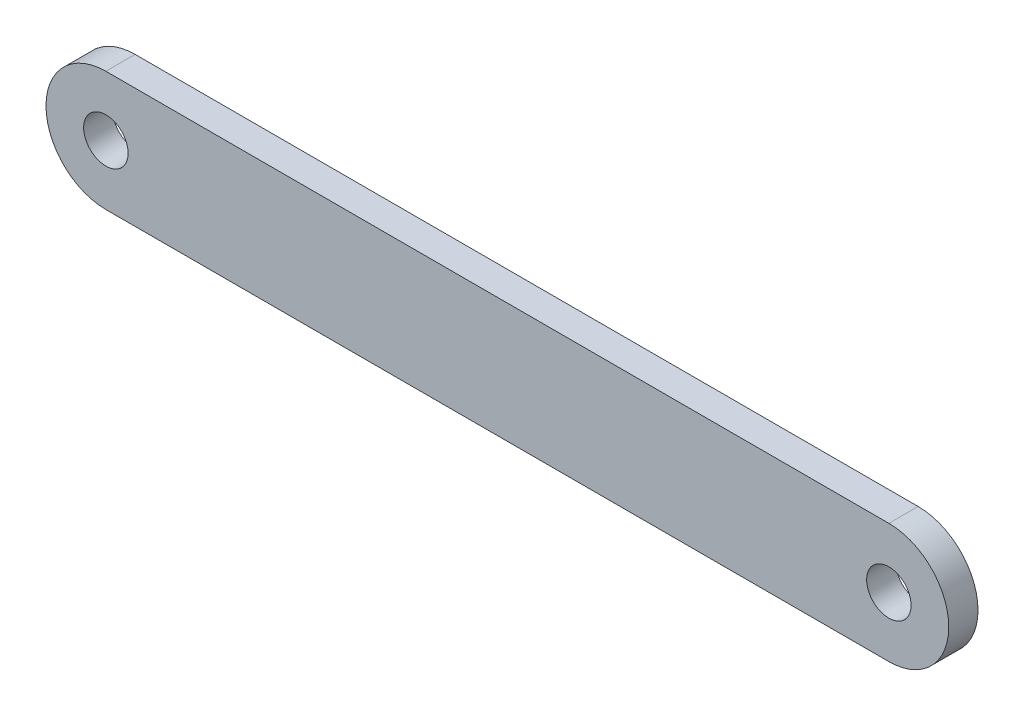
ISO-10303-21;
HEADER;
FILE_DESCRIPTION(('STEP AP214'),'2;1');
FILE_NAME('part.step','',(''),(''),'','','');
FILE_SCHEMA(('AUTOMOTIVE_DESIGN { 1 0 10303 214 1 1 1 1 }'));
ENDSEC;
DATA;
#1=APPLICATION_CONTEXT('core data for automotive mechanical design processes');
#2=APPLICATION_PROTOCOL_DEFINITION('international standard','automotive_design',2000,#1);
#3=PRODUCT_CONTEXT('',#1,'mechanical');
#4=PRODUCT('Part','Part','',(#3));
#5=PRODUCT_RELATED_PRODUCT_CATEGORY('part','',(#4));
#6=PRODUCT_DEFINITION_FORMATION('','',#4);
#7=PRODUCT_DEFINITION_CONTEXT('part definition',#1,'design');
#8=PRODUCT_DEFINITION('design','',#6,#7);
#9=PRODUCT_DEFINITION_SHAPE('','',#8);
#10=(LENGTH_UNIT() NAMED_UNIT(*) SI_UNIT(.MILLI.,.METRE.));
#11=(NAMED_UNIT(*) PLANE_ANGLE_UNIT() SI_UNIT($,.RADIAN.));
#12=(NAMED_UNIT(*) SI_UNIT($,.STERADIAN.) SOLID_ANGLE_UNIT());
#13=UNCERTAINTY_MEASURE_WITH_UNIT(LENGTH_MEASURE(1.E-05),#10,'distance_accuracy_value','');
#14=(GEOMETRIC_REPRESENTATION_CONTEXT(3) GLOBAL_UNCERTAINTY_ASSIGNED_CONTEXT((#13)) GLOBAL_UNIT_ASSIGNED_CONTEXT((#10,
#11,#12)) REPRESENTATION_CONTEXT('',''));
#15=CARTESIAN_POINT('',(0.,0.,0.));
#16=DIRECTION('',(0.,0.,1.));
#17=DIRECTION('',(1.,0.,0.));
#18=AXIS2_PLACEMENT_3D('',#15,#16,#17);
#19=CARTESIAN_POINT('',(-42.5,0.,3.175));
#20=DIRECTION('',(0.,0.,1.));
#21=DIRECTION('',(1.,0.,0.));
#22=AXIS2_PLACEMENT_3D('',#19,#20,#21);
#23=PLANE('',#22);
#24=CARTESIAN_POINT('',(-42.5,0.,3.175));
#25=DIRECTION('',(0.,0.,1.));
#26=DIRECTION('',(1.,0.,0.));
#27=AXIS2_PLACEMENT_3D('',#24,#25,#26);
#28=CIRCLE('',#27,2.413);
#29=CARTESIAN_POINT('',(-40.087,0.,3.175));
#30=VERTEX_POINT('',#29);
#31=EDGE_CURVE('E100',#30,#30,#28,.T.);
#32=ORIENTED_EDGE('',*,*,#31,.F.);
#33=EDGE_LOOP('',(#32));
#34=FACE_BOUND('',#33,.T.);
#35=CARTESIAN_POINT('',(-42.5,0.,3.175));
#36=DIRECTION('',(0.,0.,1.));
#37=DIRECTION('',(1.,0.,0.));
#38=AXIS2_PLACEMENT_3D('',#35,#36,#37);
#39=CIRCLE('',#38,6.5);
#40=CARTESIAN_POINT('',(-42.5,6.5,3.175));
#41=VERTEX_POINT('',#40);
#42=CARTESIAN_POINT('',(-42.5,-6.5,3.175));
#43=VERTEX_POINT('',#42);
#44=EDGE_CURVE('E85',#41,#43,#39,.T.);
#45=ORIENTED_EDGE('',*,*,#44,.T.);
#46=DIRECTION('',(1.,0.,0.));
#47=VECTOR('',#46,1.);
#48=CARTESIAN_POINT('',(-42.5,-6.5,3.175));
#49=LINE('',#48,#47);
#50=CARTESIAN_POINT('',(42.5,-6.49999999999998,3.175));
#51=VERTEX_POINT('',#50);
#52=EDGE_CURVE('E80',#43,#51,#49,.T.);
#53=ORIENTED_EDGE('',*,*,#52,.T.);
#54=CARTESIAN_POINT('',(42.5,0.,3.175));
#55=DIRECTION('',(0.,0.,1.));
#56=DIRECTION('',(1.,0.,0.));
#57=AXIS2_PLACEMENT_3D('',#54,#55,#56);
#58=CIRCLE('',#57,6.5);
#59=CARTESIAN_POINT('',(42.5,6.50000000000002,3.175));
#60=VERTEX_POINT('',#59);
#61=EDGE_CURVE('E83',#51,#60,#58,.T.);
#62=ORIENTED_EDGE('',*,*,#61,.T.);
#63=DIRECTION('',(-1.,0.,0.));
#64=VECTOR('',#63,1.);
#65=CARTESIAN_POINT('',(-42.5,6.5,3.175));
#66=LINE('',#65,#64);
#67=EDGE_CURVE('E50',#60,#41,#66,.T.);
#68=ORIENTED_EDGE('',*,*,#67,.T.);
#69=EDGE_LOOP('',(#45,#53,#62,#68));
#70=FACE_BOUND('',#69,.T.);
#71=CARTESIAN_POINT('',(42.5,0.,3.175));
#72=DIRECTION('',(0.,0.,1.));
#73=DIRECTION('',(1.,0.,0.));
#74=AXIS2_PLACEMENT_3D('',#71,#72,#73);
#75=CIRCLE('',#74,2.413);
#76=CARTESIAN_POINT('',(44.913,0.,3.175));
#77=VERTEX_POINT('',#76);
#78=EDGE_CURVE('E115',#77,#77,#75,.T.);
#79=ORIENTED_EDGE('',*,*,#78,.F.);
#80=EDGE_LOOP('',(#79));
#81=FACE_BOUND('',#80,.T.);
#82=ADVANCED_FACE('F33',(#34,#70,#81),#23,.T.);
#83=CARTESIAN_POINT('',(-42.5,0.,0.));
#84=DIRECTION('',(0.,0.,1.));
#85=DIRECTION('',(1.,0.,0.));
#86=AXIS2_PLACEMENT_3D('',#83,#84,#85);
#87=PLANE('',#86);
#88=CARTESIAN_POINT('',(-42.5,0.,0.));
#89=DIRECTION('',(0.,0.,1.));
#90=DIRECTION('',(1.,0.,0.));
#91=AXIS2_PLACEMENT_3D('',#88,#89,#90);
#92=CIRCLE('',#91,6.5);
#93=CARTESIAN_POINT('',(-42.5,6.5,0.));
#94=VERTEX_POINT('',#93);
#95=CARTESIAN_POINT('',(-42.5,-6.5,0.));
#96=VERTEX_POINT('',#95);
#97=EDGE_CURVE('E97',#94,#96,#92,.T.);
#98=ORIENTED_EDGE('',*,*,#97,.F.);
#99=DIRECTION('',(-1.,0.,0.));
#100=VECTOR('',#99,1.);
#101=CARTESIAN_POINT('',(-42.5,6.5,0.));
#102=LINE('',#101,#100);
#103=CARTESIAN_POINT('',(42.5,6.50000000000002,0.));
#104=VERTEX_POINT('',#103);
#105=EDGE_CURVE('E73',#104,#94,#102,.T.);
#106=ORIENTED_EDGE('',*,*,#105,.F.);
#107=CARTESIAN_POINT('',(42.5,0.,0.));
#108=DIRECTION('',(0.,0.,1.));
#109=DIRECTION('',(1.,0.,0.));
#110=AXIS2_PLACEMENT_3D('',#107,#108,#109);
#111=CIRCLE('',#110,6.5);
#112=CARTESIAN_POINT('',(42.5,-6.49999999999998,0.));
#113=VERTEX_POINT('',#112);
#114=EDGE_CURVE('E67',#113,#104,#111,.T.);
#115=ORIENTED_EDGE('',*,*,#114,.F.);
#116=DIRECTION('',(1.,0.,0.));
#117=VECTOR('',#116,1.);
#118=CARTESIAN_POINT('',(-42.5,-6.5,0.));
#119=LINE('',#118,#117);
#120=EDGE_CURVE('E89',#96,#113,#119,.T.);
#121=ORIENTED_EDGE('',*,*,#120,.F.);
#122=EDGE_LOOP('',(#98,#106,#115,#121));
#123=FACE_BOUND('',#122,.T.);
#124=CARTESIAN_POINT('',(-42.5,0.,0.));
#125=DIRECTION('',(0.,0.,1.));
#126=DIRECTION('',(1.,0.,0.));
#127=AXIS2_PLACEMENT_3D('',#124,#125,#126);
#128=CIRCLE('',#127,2.413);
#129=CARTESIAN_POINT('',(-40.087,0.,0.));
#130=VERTEX_POINT('',#129);
#131=EDGE_CURVE('E112',#130,#130,#128,.T.);
#132=ORIENTED_EDGE('',*,*,#131,.T.);
#133=EDGE_LOOP('',(#132));
#134=FACE_BOUND('',#133,.T.);
#135=CARTESIAN_POINT('',(42.5,0.,0.));
#136=DIRECTION('',(0.,0.,1.));
#137=DIRECTION('',(1.,0.,0.));
#138=AXIS2_PLACEMENT_3D('',#135,#136,#137);
#139=CIRCLE('',#138,2.413);
#140=CARTESIAN_POINT('',(44.913,0.,0.));
#141=VERTEX_POINT('',#140);
#142=EDGE_CURVE('E118',#141,#141,#139,.T.);
#143=ORIENTED_EDGE('',*,*,#142,.T.);
#144=EDGE_LOOP('',(#143));
#145=FACE_BOUND('',#144,.T.);
#146=ADVANCED_FACE('F108',(#123,#134,#145),#87,.F.);
#147=CARTESIAN_POINT('',(-42.5,0.,3.175));
#148=DIRECTION('',(0.,0.,-1.));
#149=DIRECTION('',(-1.,0.,0.));
#150=AXIS2_PLACEMENT_3D('',#147,#148,#149);
#151=CYLINDRICAL_SURFACE('',#150,6.5);
#152=ORIENTED_EDGE('',*,*,#97,.T.);
#153=DIRECTION('',(0.,0.,-1.));
#154=VECTOR('',#153,1.);
#155=CARTESIAN_POINT('',(-42.5,-6.5,3.175));
#156=LINE('',#155,#154);
#157=EDGE_CURVE('E11',#43,#96,#156,.T.);
#158=ORIENTED_EDGE('',*,*,#157,.F.);
#159=ORIENTED_EDGE('',*,*,#44,.F.);
#160=DIRECTION('',(0.,0.,-1.));
#161=VECTOR('',#160,1.);
#162=CARTESIAN_POINT('',(-42.5,6.5,3.175));
#163=LINE('',#162,#161);
#164=EDGE_CURVE('E93',#41,#94,#163,.T.);
#165=ORIENTED_EDGE('',*,*,#164,.T.);
#166=EDGE_LOOP('',(#152,#158,#159,#165));
#167=FACE_BOUND('',#166,.T.);
#168=ADVANCED_FACE('F35',(#167),#151,.T.);
#169=CARTESIAN_POINT('',(-42.5,-6.5,3.175));
#170=DIRECTION('',(0.,1.,0.));
#171=DIRECTION('',(-1.,0.,0.));
#172=AXIS2_PLACEMENT_3D('',#169,#170,#171);
#173=PLANE('',#172);
#174=ORIENTED_EDGE('',*,*,#120,.T.);
#175=DIRECTION('',(0.,0.,-1.));
#176=VECTOR('',#175,1.);
#177=CARTESIAN_POINT('',(42.5,-6.49999999999998,3.175));
#178=LINE('',#177,#176);
#179=EDGE_CURVE('E42',#51,#113,#178,.T.);
#180=ORIENTED_EDGE('',*,*,#179,.F.);
#181=ORIENTED_EDGE('',*,*,#52,.F.);
#182=ORIENTED_EDGE('',*,*,#157,.T.);
#183=EDGE_LOOP('',(#174,#180,#181,#182));
#184=FACE_BOUND('',#183,.T.);
#185=ADVANCED_FACE('F88',(#184),#173,.F.);
#186=CARTESIAN_POINT('',(42.5,0.,3.175));
#187=DIRECTION('',(0.,0.,-1.));
#188=DIRECTION('',(-1.,0.,0.));
#189=AXIS2_PLACEMENT_3D('',#186,#187,#188);
#190=CYLINDRICAL_SURFACE('',#189,6.5);
#191=ORIENTED_EDGE('',*,*,#114,.T.);
#192=DIRECTION('',(0.,0.,-1.));
#193=VECTOR('',#192,1.);
#194=CARTESIAN_POINT('',(42.5,6.50000000000002,3.175));
#195=LINE('',#194,#193);
#196=EDGE_CURVE('E90',#60,#104,#195,.T.);
#197=ORIENTED_EDGE('',*,*,#196,.F.);
#198=ORIENTED_EDGE('',*,*,#61,.F.);
#199=ORIENTED_EDGE('',*,*,#179,.T.);
#200=EDGE_LOOP('',(#191,#197,#198,#199));
#201=FACE_BOUND('',#200,.T.);
#202=ADVANCED_FACE('F91',(#201),#190,.T.);
#203=CARTESIAN_POINT('',(-42.5,6.5,3.175));
#204=DIRECTION('',(0.,-1.,0.));
#205=DIRECTION('',(1.,0.,0.));
#206=AXIS2_PLACEMENT_3D('',#203,#204,#205);
#207=PLANE('',#206);
#208=ORIENTED_EDGE('',*,*,#105,.T.);
#209=ORIENTED_EDGE('',*,*,#164,.F.);
#210=ORIENTED_EDGE('',*,*,#67,.F.);
#211=ORIENTED_EDGE('',*,*,#196,.T.);
#212=EDGE_LOOP('',(#208,#209,#210,#211));
#213=FACE_BOUND('',#212,.T.);
#214=ADVANCED_FACE('F105',(#213),#207,.F.);
#215=CARTESIAN_POINT('',(-42.5,0.,3.175));
#216=DIRECTION('',(0.,0.,-1.));
#217=DIRECTION('',(-1.,0.,0.));
#218=AXIS2_PLACEMENT_3D('',#215,#216,#217);
#219=CYLINDRICAL_SURFACE('',#218,2.413);
#220=ORIENTED_EDGE('',*,*,#31,.T.);
#221=EDGE_LOOP('',(#220));
#222=FACE_BOUND('',#221,.T.);
#223=ORIENTED_EDGE('',*,*,#131,.F.);
#224=EDGE_LOOP('',(#223));
#225=FACE_BOUND('',#224,.T.);
#226=ADVANCED_FACE('F135',(#222,#225),#219,.F.);
#227=CARTESIAN_POINT('',(42.5,0.,3.175));
#228=DIRECTION('',(0.,0.,-1.));
#229=DIRECTION('',(-1.,0.,0.));
#230=AXIS2_PLACEMENT_3D('',#227,#228,#229);
#231=CYLINDRICAL_SURFACE('',#230,2.413);
#232=ORIENTED_EDGE('',*,*,#78,.T.);
#233=EDGE_LOOP('',(#232));
#234=FACE_BOUND('',#233,.T.);
#235=ORIENTED_EDGE('',*,*,#142,.F.);
#236=EDGE_LOOP('',(#235));
#237=FACE_BOUND('',#236,.T.);
#238=ADVANCED_FACE('F124',(#234,#237),#231,.F.);
#239=CLOSED_SHELL('',(#82,#146,#168,#185,#202,#214,#226,#238));
#240=MANIFOLD_SOLID_BREP('B2',#239);
#241=ADVANCED_BREP_SHAPE_REPRESENTATION('',(#18,#240),#14);
#242=SHAPE_DEFINITION_REPRESENTATION(#9,#241);
ENDSEC;
END-ISO-10303-21;
